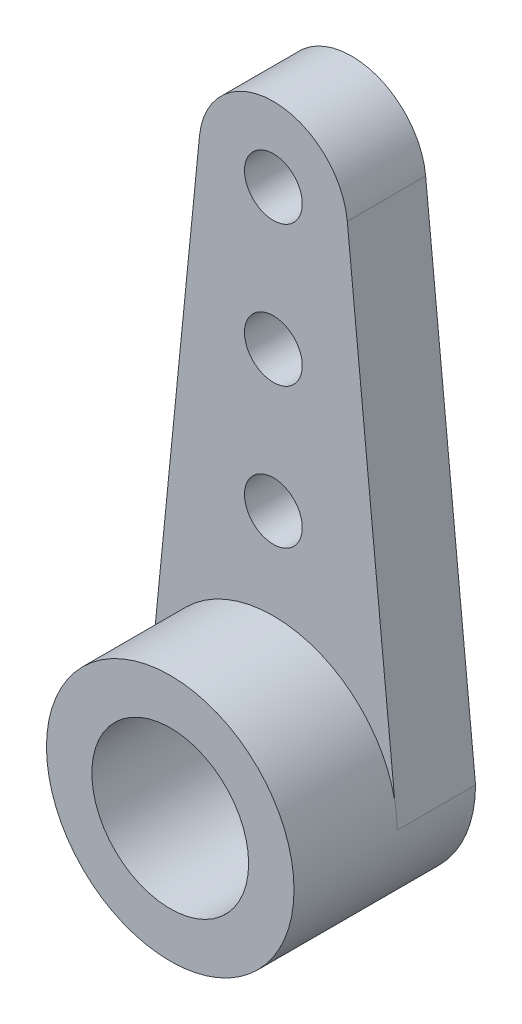
ISO-10303-21;
HEADER;
FILE_DESCRIPTION(('STEP AP214'),'2;1');
FILE_NAME('part.step','',(''),(''),'','','');
FILE_SCHEMA(('AUTOMOTIVE_DESIGN { 1 0 10303 214 1 1 1 1 }'));
ENDSEC;
DATA;
#1=APPLICATION_CONTEXT('core data for automotive mechanical design processes');
#2=APPLICATION_PROTOCOL_DEFINITION('international standard','automotive_design',2000,#1);
#3=PRODUCT_CONTEXT('',#1,'mechanical');
#4=PRODUCT('Part','Part','',(#3));
#5=PRODUCT_RELATED_PRODUCT_CATEGORY('part','',(#4));
#6=PRODUCT_DEFINITION_FORMATION('','',#4);
#7=PRODUCT_DEFINITION_CONTEXT('part definition',#1,'design');
#8=PRODUCT_DEFINITION('design','',#6,#7);
#9=PRODUCT_DEFINITION_SHAPE('','',#8);
#10=(LENGTH_UNIT() NAMED_UNIT(*) SI_UNIT(.MILLI.,.METRE.));
#11=(NAMED_UNIT(*) PLANE_ANGLE_UNIT() SI_UNIT($,.RADIAN.));
#12=(NAMED_UNIT(*) SI_UNIT($,.STERADIAN.) SOLID_ANGLE_UNIT());
#13=UNCERTAINTY_MEASURE_WITH_UNIT(LENGTH_MEASURE(1.E-05),#10,'distance_accuracy_value','');
#14=(GEOMETRIC_REPRESENTATION_CONTEXT(3) GLOBAL_UNCERTAINTY_ASSIGNED_CONTEXT((#13)) GLOBAL_UNIT_ASSIGNED_CONTEXT((#10,
#11,#12)) REPRESENTATION_CONTEXT('',''));
#15=CARTESIAN_POINT('',(0.,0.,0.));
#16=DIRECTION('',(0.,0.,1.));
#17=DIRECTION('',(1.,0.,0.));
#18=AXIS2_PLACEMENT_3D('',#15,#16,#17);
#19=CARTESIAN_POINT('',(0.,12.0172411860474,1.9));
#20=DIRECTION('',(0.,0.,1.));
#21=DIRECTION('',(1.,0.,0.));
#22=AXIS2_PLACEMENT_3D('',#19,#20,#21);
#23=PLANE('',#22);
#24=CARTESIAN_POINT('',(0.,0.,1.9));
#25=DIRECTION('',(0.,0.,-1.));
#26=DIRECTION('',(-1.,0.,0.));
#27=AXIS2_PLACEMENT_3D('',#24,#25,#26);
#28=CIRCLE('',#27,3.);
#29=CARTESIAN_POINT('',(-2.94145816468227,0.589765941220731,1.9));
#30=VERTEX_POINT('',#29);
#31=CARTESIAN_POINT('',(2.94145816468227,0.589765941220731,1.9));
#32=VERTEX_POINT('',#31);
#33=EDGE_CURVE('E141',#30,#32,#28,.T.);
#34=ORIENTED_EDGE('',*,*,#33,.T.);
#35=DIRECTION('',(0.0987773888749546,-0.995109555499818,0.));
#36=VECTOR('',#35,1.);
#37=CARTESIAN_POINT('',(3.,0.,1.9));
#38=LINE('',#37,#36);
#39=CARTESIAN_POINT('',(1.79119719989968,12.1777992999749,1.9));
#40=VERTEX_POINT('',#39);
#41=EDGE_CURVE('E110',#40,#32,#38,.T.);
#42=ORIENTED_EDGE('',*,*,#41,.F.);
#43=CARTESIAN_POINT('',(0.,12.,1.9));
#44=DIRECTION('',(0.,0.,-1.));
#45=DIRECTION('',(1.,0.,0.));
#46=AXIS2_PLACEMENT_3D('',#43,#44,#45);
#47=CIRCLE('',#46,1.8);
#48=CARTESIAN_POINT('',(-1.79119719989968,12.1777992999749,1.9));
#49=VERTEX_POINT('',#48);
#50=EDGE_CURVE('E25',#49,#40,#47,.T.);
#51=ORIENTED_EDGE('',*,*,#50,.F.);
#52=DIRECTION('',(0.0987773888749546,0.995109555499818,0.));
#53=VECTOR('',#52,1.);
#54=CARTESIAN_POINT('',(-1.79119719989968,12.1777992999749,1.9));
#55=LINE('',#54,#53);
#56=EDGE_CURVE('E143',#30,#49,#55,.T.);
#57=ORIENTED_EDGE('',*,*,#56,.F.);
#58=EDGE_LOOP('',(#34,#42,#51,#57));
#59=FACE_BOUND('',#58,.T.);
#60=CARTESIAN_POINT('',(0.,12.,1.9));
#61=DIRECTION('',(0.,0.,-1.));
#62=DIRECTION('',(1.,0.,0.));
#63=AXIS2_PLACEMENT_3D('',#60,#61,#62);
#64=CIRCLE('',#63,0.7);
#65=CARTESIAN_POINT('',(-0.7,12.,1.9));
#66=VERTEX_POINT('',#65);
#67=EDGE_CURVE('E90',#66,#66,#64,.T.);
#68=ORIENTED_EDGE('',*,*,#67,.T.);
#69=EDGE_LOOP('',(#68));
#70=FACE_BOUND('',#69,.T.);
#71=CARTESIAN_POINT('',(0.,8.6,1.9));
#72=DIRECTION('',(0.,0.,-1.));
#73=DIRECTION('',(1.,0.,0.));
#74=AXIS2_PLACEMENT_3D('',#71,#72,#73);
#75=CIRCLE('',#74,0.7);
#76=CARTESIAN_POINT('',(-0.7,8.6,1.9));
#77=VERTEX_POINT('',#76);
#78=EDGE_CURVE('E91',#77,#77,#75,.T.);
#79=ORIENTED_EDGE('',*,*,#78,.T.);
#80=EDGE_LOOP('',(#79));
#81=FACE_BOUND('',#80,.T.);
#82=CARTESIAN_POINT('',(0.,5.2,1.9));
#83=DIRECTION('',(0.,0.,-1.));
#84=DIRECTION('',(1.,0.,0.));
#85=AXIS2_PLACEMENT_3D('',#82,#83,#84);
#86=CIRCLE('',#85,0.7);
#87=CARTESIAN_POINT('',(-0.7,5.2,1.9));
#88=VERTEX_POINT('',#87);
#89=EDGE_CURVE('E100',#88,#88,#86,.T.);
#90=ORIENTED_EDGE('',*,*,#89,.T.);
#91=EDGE_LOOP('',(#90));
#92=FACE_BOUND('',#91,.T.);
#93=ADVANCED_FACE('F16',(#59,#70,#81,#92),#23,.T.);
#94=CARTESIAN_POINT('',(0.,12.0172411860474,0.));
#95=DIRECTION('',(0.,0.,1.));
#96=DIRECTION('',(1.,0.,0.));
#97=AXIS2_PLACEMENT_3D('',#94,#95,#96);
#98=PLANE('',#97);
#99=CARTESIAN_POINT('',(0.,12.,0.));
#100=DIRECTION('',(0.,0.,1.));
#101=DIRECTION('',(1.,0.,0.));
#102=AXIS2_PLACEMENT_3D('',#99,#100,#101);
#103=CIRCLE('',#102,1.8);
#104=CARTESIAN_POINT('',(1.79119719989968,12.1777992999749,0.));
#105=VERTEX_POINT('',#104);
#106=CARTESIAN_POINT('',(-1.79119719989968,12.1777992999749,0.));
#107=VERTEX_POINT('',#106);
#108=EDGE_CURVE('E10',#105,#107,#103,.T.);
#109=ORIENTED_EDGE('',*,*,#108,.F.);
#110=DIRECTION('',(-0.0987773888749546,0.995109555499818,0.));
#111=VECTOR('',#110,1.);
#112=CARTESIAN_POINT('',(3.,0.,0.));
#113=LINE('',#112,#111);
#114=CARTESIAN_POINT('',(3.,0.,0.));
#115=VERTEX_POINT('',#114);
#116=EDGE_CURVE('E109',#115,#105,#113,.T.);
#117=ORIENTED_EDGE('',*,*,#116,.F.);
#118=CARTESIAN_POINT('',(0.,0.,0.));
#119=DIRECTION('',(0.,0.,1.));
#120=DIRECTION('',(1.,0.,0.));
#121=AXIS2_PLACEMENT_3D('',#118,#119,#120);
#122=CIRCLE('',#121,3.);
#123=CARTESIAN_POINT('',(-3.,0.,0.));
#124=VERTEX_POINT('',#123);
#125=EDGE_CURVE('E138',#124,#115,#122,.T.);
#126=ORIENTED_EDGE('',*,*,#125,.F.);
#127=DIRECTION('',(-0.0987773888749546,-0.995109555499818,0.));
#128=VECTOR('',#127,1.);
#129=CARTESIAN_POINT('',(-1.79119719989968,12.1777992999749,0.));
#130=LINE('',#129,#128);
#131=EDGE_CURVE('E149',#107,#124,#130,.T.);
#132=ORIENTED_EDGE('',*,*,#131,.F.);
#133=EDGE_LOOP('',(#109,#117,#126,#132));
#134=FACE_BOUND('',#133,.T.);
#135=CARTESIAN_POINT('',(0.,0.,0.));
#136=DIRECTION('',(0.,0.,1.));
#137=DIRECTION('',(-1.,0.,0.));
#138=AXIS2_PLACEMENT_3D('',#135,#136,#137);
#139=CIRCLE('',#138,1.9);
#140=CARTESIAN_POINT('',(1.9,0.,0.));
#141=VERTEX_POINT('',#140);
#142=EDGE_CURVE('E120',#141,#141,#139,.T.);
#143=ORIENTED_EDGE('',*,*,#142,.T.);
#144=EDGE_LOOP('',(#143));
#145=FACE_BOUND('',#144,.T.);
#146=CARTESIAN_POINT('',(0.,12.,0.));
#147=DIRECTION('',(0.,0.,1.));
#148=DIRECTION('',(1.,0.,0.));
#149=AXIS2_PLACEMENT_3D('',#146,#147,#148);
#150=CIRCLE('',#149,0.7);
#151=CARTESIAN_POINT('',(-0.7,12.,0.));
#152=VERTEX_POINT('',#151);
#153=EDGE_CURVE('E93',#152,#152,#150,.T.);
#154=ORIENTED_EDGE('',*,*,#153,.T.);
#155=EDGE_LOOP('',(#154));
#156=FACE_BOUND('',#155,.T.);
#157=CARTESIAN_POINT('',(0.,8.6,0.));
#158=DIRECTION('',(0.,0.,1.));
#159=DIRECTION('',(1.,0.,0.));
#160=AXIS2_PLACEMENT_3D('',#157,#158,#159);
#161=CIRCLE('',#160,0.7);
#162=CARTESIAN_POINT('',(-0.7,8.6,0.));
#163=VERTEX_POINT('',#162);
#164=EDGE_CURVE('E87',#163,#163,#161,.T.);
#165=ORIENTED_EDGE('',*,*,#164,.T.);
#166=EDGE_LOOP('',(#165));
#167=FACE_BOUND('',#166,.T.);
#168=CARTESIAN_POINT('',(0.,5.2,0.));
#169=DIRECTION('',(0.,0.,1.));
#170=DIRECTION('',(1.,0.,0.));
#171=AXIS2_PLACEMENT_3D('',#168,#169,#170);
#172=CIRCLE('',#171,0.7);
#173=CARTESIAN_POINT('',(-0.7,5.2,0.));
#174=VERTEX_POINT('',#173);
#175=EDGE_CURVE('E95',#174,#174,#172,.T.);
#176=ORIENTED_EDGE('',*,*,#175,.T.);
#177=EDGE_LOOP('',(#176));
#178=FACE_BOUND('',#177,.T.);
#179=ADVANCED_FACE('F18',(#134,#145,#156,#167,#178),#98,.F.);
#180=CARTESIAN_POINT('',(0.,12.,0.));
#181=DIRECTION('',(0.,0.,-1.));
#182=DIRECTION('',(1.,0.,0.));
#183=AXIS2_PLACEMENT_3D('',#180,#181,#182);
#184=CYLINDRICAL_SURFACE('',#183,1.8);
#185=DIRECTION('',(0.,0.,1.));
#186=VECTOR('',#185,1.);
#187=CARTESIAN_POINT('',(-1.79119719989968,12.1777992999749,0.));
#188=LINE('',#187,#186);
#189=EDGE_CURVE('E147',#107,#49,#188,.T.);
#190=ORIENTED_EDGE('',*,*,#189,.T.);
#191=ORIENTED_EDGE('',*,*,#50,.T.);
#192=DIRECTION('',(0.,0.,1.));
#193=VECTOR('',#192,1.);
#194=CARTESIAN_POINT('',(1.79119719989968,12.1777992999749,0.));
#195=LINE('',#194,#193);
#196=EDGE_CURVE('E132',#105,#40,#195,.T.);
#197=ORIENTED_EDGE('',*,*,#196,.F.);
#198=ORIENTED_EDGE('',*,*,#108,.T.);
#199=EDGE_LOOP('',(#190,#191,#197,#198));
#200=FACE_BOUND('',#199,.T.);
#201=ADVANCED_FACE('F154',(#200),#184,.T.);
#202=CARTESIAN_POINT('',(-3.,0.,0.));
#203=DIRECTION('',(-0.995109555499818,0.0987773888749546,0.));
#204=DIRECTION('',(0.,0.,1.));
#205=AXIS2_PLACEMENT_3D('',#202,#203,#204);
#206=PLANE('',#205);
#207=DIRECTION('',(0.0987773888749546,0.995109555499818,0.));
#208=VECTOR('',#207,1.);
#209=CARTESIAN_POINT('',(-1.79119719989968,12.1777992999749,1.9));
#210=LINE('',#209,#208);
#211=CARTESIAN_POINT('',(-3.,0.,1.9));
#212=VERTEX_POINT('',#211);
#213=EDGE_CURVE('E115',#212,#30,#210,.T.);
#214=ORIENTED_EDGE('',*,*,#213,.T.);
#215=ORIENTED_EDGE('',*,*,#56,.T.);
#216=ORIENTED_EDGE('',*,*,#189,.F.);
#217=ORIENTED_EDGE('',*,*,#131,.T.);
#218=DIRECTION('',(0.,0.,1.));
#219=VECTOR('',#218,1.);
#220=CARTESIAN_POINT('',(-3.,0.,0.));
#221=LINE('',#220,#219);
#222=EDGE_CURVE('E135',#124,#212,#221,.T.);
#223=ORIENTED_EDGE('',*,*,#222,.T.);
#224=EDGE_LOOP('',(#214,#215,#216,#217,#223));
#225=FACE_BOUND('',#224,.T.);
#226=ADVANCED_FACE('F174',(#225),#206,.T.);
#227=CARTESIAN_POINT('',(0.,0.,0.));
#228=DIRECTION('',(0.,0.,-1.));
#229=DIRECTION('',(1.,0.,0.));
#230=AXIS2_PLACEMENT_3D('',#227,#228,#229);
#231=CYLINDRICAL_SURFACE('',#230,3.);
#232=ORIENTED_EDGE('',*,*,#222,.F.);
#233=ORIENTED_EDGE('',*,*,#125,.T.);
#234=DIRECTION('',(0.,0.,1.));
#235=VECTOR('',#234,1.);
#236=CARTESIAN_POINT('',(3.,0.,0.));
#237=LINE('',#236,#235);
#238=CARTESIAN_POINT('',(3.,0.,1.9));
#239=VERTEX_POINT('',#238);
#240=EDGE_CURVE('E106',#115,#239,#237,.T.);
#241=ORIENTED_EDGE('',*,*,#240,.T.);
#242=CARTESIAN_POINT('',(0.,0.,1.9));
#243=DIRECTION('',(0.,0.,-1.));
#244=DIRECTION('',(-1.,0.,0.));
#245=AXIS2_PLACEMENT_3D('',#242,#243,#244);
#246=CIRCLE('',#245,3.);
#247=EDGE_CURVE('E99',#32,#239,#246,.T.);
#248=ORIENTED_EDGE('',*,*,#247,.F.);
#249=ORIENTED_EDGE('',*,*,#33,.F.);
#250=CARTESIAN_POINT('',(0.,0.,1.9));
#251=DIRECTION('',(0.,0.,-1.));
#252=DIRECTION('',(-1.,0.,0.));
#253=AXIS2_PLACEMENT_3D('',#250,#251,#252);
#254=CIRCLE('',#253,3.);
#255=EDGE_CURVE('E114',#212,#30,#254,.T.);
#256=ORIENTED_EDGE('',*,*,#255,.F.);
#257=EDGE_LOOP('',(#232,#233,#241,#248,#249,#256));
#258=FACE_BOUND('',#257,.T.);
#259=CARTESIAN_POINT('',(0.,0.,4.4));
#260=DIRECTION('',(0.,0.,-1.));
#261=DIRECTION('',(-1.,0.,0.));
#262=AXIS2_PLACEMENT_3D('',#259,#260,#261);
#263=CIRCLE('',#262,3.);
#264=CARTESIAN_POINT('',(3.,0.,4.4));
#265=VERTEX_POINT('',#264);
#266=EDGE_CURVE('E104',#265,#265,#263,.T.);
#267=ORIENTED_EDGE('',*,*,#266,.T.);
#268=EDGE_LOOP('',(#267));
#269=FACE_BOUND('',#268,.T.);
#270=ADVANCED_FACE('F166',(#258,#269),#231,.T.);
#271=CARTESIAN_POINT('',(1.79119719989968,12.1777992999749,0.));
#272=DIRECTION('',(0.995109555499818,0.0987773888749546,0.));
#273=DIRECTION('',(0.,0.,-1.));
#274=AXIS2_PLACEMENT_3D('',#271,#272,#273);
#275=PLANE('',#274);
#276=ORIENTED_EDGE('',*,*,#41,.T.);
#277=DIRECTION('',(0.0987773888749546,-0.995109555499818,0.));
#278=VECTOR('',#277,1.);
#279=CARTESIAN_POINT('',(3.,0.,1.9));
#280=LINE('',#279,#278);
#281=EDGE_CURVE('E111',#32,#239,#280,.T.);
#282=ORIENTED_EDGE('',*,*,#281,.T.);
#283=ORIENTED_EDGE('',*,*,#240,.F.);
#284=ORIENTED_EDGE('',*,*,#116,.T.);
#285=ORIENTED_EDGE('',*,*,#196,.T.);
#286=EDGE_LOOP('',(#276,#282,#283,#284,#285));
#287=FACE_BOUND('',#286,.T.);
#288=ADVANCED_FACE('F157',(#287),#275,.T.);
#289=CARTESIAN_POINT('',(0.,0.,0.));
#290=DIRECTION('',(0.,0.,-1.));
#291=DIRECTION('',(-1.,0.,0.));
#292=AXIS2_PLACEMENT_3D('',#289,#290,#291);
#293=CYLINDRICAL_SURFACE('',#292,1.9);
#294=ORIENTED_EDGE('',*,*,#142,.F.);
#295=EDGE_LOOP('',(#294));
#296=FACE_BOUND('',#295,.T.);
#297=CARTESIAN_POINT('',(0.,0.,4.4));
#298=DIRECTION('',(0.,0.,-1.));
#299=DIRECTION('',(-1.,0.,0.));
#300=AXIS2_PLACEMENT_3D('',#297,#298,#299);
#301=CIRCLE('',#300,1.9);
#302=CARTESIAN_POINT('',(1.9,0.,4.4));
#303=VERTEX_POINT('',#302);
#304=EDGE_CURVE('E102',#303,#303,#301,.T.);
#305=ORIENTED_EDGE('',*,*,#304,.F.);
#306=EDGE_LOOP('',(#305));
#307=FACE_BOUND('',#306,.T.);
#308=ADVANCED_FACE('F203',(#296,#307),#293,.F.);
#309=CARTESIAN_POINT('',(0.,0.,4.4));
#310=DIRECTION('',(0.,0.,-1.));
#311=DIRECTION('',(-1.,0.,0.));
#312=AXIS2_PLACEMENT_3D('',#309,#310,#311);
#313=PLANE('',#312);
#314=ORIENTED_EDGE('',*,*,#266,.F.);
#315=EDGE_LOOP('',(#314));
#316=FACE_BOUND('',#315,.T.);
#317=ORIENTED_EDGE('',*,*,#304,.T.);
#318=EDGE_LOOP('',(#317));
#319=FACE_BOUND('',#318,.T.);
#320=ADVANCED_FACE('F194',(#316,#319),#313,.F.);
#321=CARTESIAN_POINT('',(0.,0.,1.9));
#322=DIRECTION('',(0.,0.,-1.));
#323=DIRECTION('',(-1.,0.,0.));
#324=AXIS2_PLACEMENT_3D('',#321,#322,#323);
#325=PLANE('',#324);
#326=ORIENTED_EDGE('',*,*,#281,.F.);
#327=ORIENTED_EDGE('',*,*,#247,.T.);
#328=EDGE_LOOP('',(#326,#327));
#329=FACE_BOUND('',#328,.T.);
#330=ADVANCED_FACE('F179',(#329),#325,.T.);
#331=CARTESIAN_POINT('',(0.,0.,1.9));
#332=DIRECTION('',(0.,0.,-1.));
#333=DIRECTION('',(-1.,0.,0.));
#334=AXIS2_PLACEMENT_3D('',#331,#332,#333);
#335=PLANE('',#334);
#336=ORIENTED_EDGE('',*,*,#213,.F.);
#337=ORIENTED_EDGE('',*,*,#255,.T.);
#338=EDGE_LOOP('',(#336,#337));
#339=FACE_BOUND('',#338,.T.);
#340=ADVANCED_FACE('F172',(#339),#335,.T.);
#341=CARTESIAN_POINT('',(0.,12.,0.));
#342=DIRECTION('',(0.,0.,-1.));
#343=DIRECTION('',(1.,0.,0.));
#344=AXIS2_PLACEMENT_3D('',#341,#342,#343);
#345=CYLINDRICAL_SURFACE('',#344,0.7);
#346=ORIENTED_EDGE('',*,*,#153,.F.);
#347=EDGE_LOOP('',(#346));
#348=FACE_BOUND('',#347,.T.);
#349=ORIENTED_EDGE('',*,*,#67,.F.);
#350=EDGE_LOOP('',(#349));
#351=FACE_BOUND('',#350,.T.);
#352=ADVANCED_FACE('F201',(#348,#351),#345,.F.);
#353=CARTESIAN_POINT('',(0.,8.6,0.));
#354=DIRECTION('',(0.,0.,-1.));
#355=DIRECTION('',(1.,0.,0.));
#356=AXIS2_PLACEMENT_3D('',#353,#354,#355);
#357=CYLINDRICAL_SURFACE('',#356,0.7);
#358=ORIENTED_EDGE('',*,*,#164,.F.);
#359=EDGE_LOOP('',(#358));
#360=FACE_BOUND('',#359,.T.);
#361=ORIENTED_EDGE('',*,*,#78,.F.);
#362=EDGE_LOOP('',(#361));
#363=FACE_BOUND('',#362,.T.);
#364=ADVANCED_FACE('F218',(#360,#363),#357,.F.);
#365=CARTESIAN_POINT('',(0.,5.2,0.));
#366=DIRECTION('',(0.,0.,-1.));
#367=DIRECTION('',(1.,0.,0.));
#368=AXIS2_PLACEMENT_3D('',#365,#366,#367);
#369=CYLINDRICAL_SURFACE('',#368,0.7);
#370=ORIENTED_EDGE('',*,*,#175,.F.);
#371=EDGE_LOOP('',(#370));
#372=FACE_BOUND('',#371,.T.);
#373=ORIENTED_EDGE('',*,*,#89,.F.);
#374=EDGE_LOOP('',(#373));
#375=FACE_BOUND('',#374,.T.);
#376=ADVANCED_FACE('F216',(#372,#375),#369,.F.);
#377=CLOSED_SHELL('',(#93,#179,#201,#226,#270,#288,#308,#320,#330,#340,#352,#364,#376));
#378=MANIFOLD_SOLID_BREP('B1',#377);
#379=ADVANCED_BREP_SHAPE_REPRESENTATION('',(#18,#378),#14);
#380=SHAPE_DEFINITION_REPRESENTATION(#9,#379);
ENDSEC;
END-ISO-10303-21;
